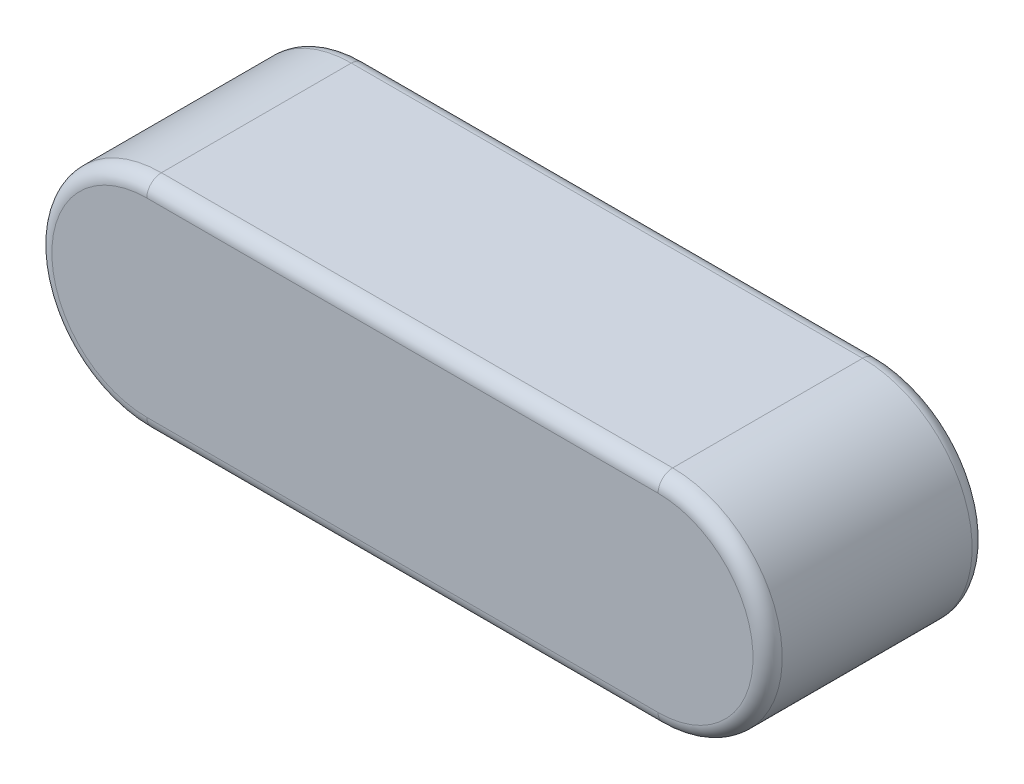
ISO-10303-21;
HEADER;
FILE_DESCRIPTION(('STEP AP214'),'2;1');
FILE_NAME('part.step','',(''),(''),'','','');
FILE_SCHEMA(('AUTOMOTIVE_DESIGN { 1 0 10303 214 1 1 1 1 }'));
ENDSEC;
DATA;
#1=APPLICATION_CONTEXT('core data for automotive mechanical design processes');
#2=APPLICATION_PROTOCOL_DEFINITION('international standard','automotive_design',2000,#1);
#3=PRODUCT_CONTEXT('',#1,'mechanical');
#4=PRODUCT('Part','Part','',(#3));
#5=PRODUCT_RELATED_PRODUCT_CATEGORY('part','',(#4));
#6=PRODUCT_DEFINITION_FORMATION('','',#4);
#7=PRODUCT_DEFINITION_CONTEXT('part definition',#1,'design');
#8=PRODUCT_DEFINITION('design','',#6,#7);
#9=PRODUCT_DEFINITION_SHAPE('','',#8);
#10=(LENGTH_UNIT() NAMED_UNIT(*) SI_UNIT(.MILLI.,.METRE.));
#11=(NAMED_UNIT(*) PLANE_ANGLE_UNIT() SI_UNIT($,.RADIAN.));
#12=(NAMED_UNIT(*) SI_UNIT($,.STERADIAN.) SOLID_ANGLE_UNIT());
#13=UNCERTAINTY_MEASURE_WITH_UNIT(LENGTH_MEASURE(1.E-05),#10,'distance_accuracy_value','');
#14=(GEOMETRIC_REPRESENTATION_CONTEXT(3) GLOBAL_UNCERTAINTY_ASSIGNED_CONTEXT((#13)) GLOBAL_UNIT_ASSIGNED_CONTEXT((#10,
#11,#12)) REPRESENTATION_CONTEXT('',''));
#15=CARTESIAN_POINT('',(0.,0.,0.));
#16=DIRECTION('',(0.,0.,1.));
#17=DIRECTION('',(1.,0.,0.));
#18=AXIS2_PLACEMENT_3D('',#15,#16,#17);
#19=CARTESIAN_POINT('',(-7.,0.,6.));
#20=DIRECTION('',(0.,0.,-1.));
#21=DIRECTION('',(-1.,0.,0.));
#22=AXIS2_PLACEMENT_3D('',#19,#20,#21);
#23=CYLINDRICAL_SURFACE('',#22,3.);
#24=DIRECTION('',(0.,0.,-1.));
#25=VECTOR('',#24,1.);
#26=CARTESIAN_POINT('',(-7.,-3.,6.));
#27=LINE('',#26,#25);
#28=CARTESIAN_POINT('',(-7.,-3.,5.6));
#29=VERTEX_POINT('',#28);
#30=CARTESIAN_POINT('',(-7.,-3.,0.4));
#31=VERTEX_POINT('',#30);
#32=EDGE_CURVE('E134',#29,#31,#27,.T.);
#33=ORIENTED_EDGE('',*,*,#32,.F.);
#34=CARTESIAN_POINT('',(-7.,0.,5.6));
#35=DIRECTION('',(0.,0.,1.));
#36=DIRECTION('',(1.,0.,0.));
#37=AXIS2_PLACEMENT_3D('',#34,#35,#36);
#38=CIRCLE('',#37,3.);
#39=CARTESIAN_POINT('',(-7.,3.,5.6));
#40=VERTEX_POINT('',#39);
#41=EDGE_CURVE('E68',#29,#40,#38,.F.);
#42=ORIENTED_EDGE('',*,*,#41,.T.);
#43=DIRECTION('',(0.,0.,-1.));
#44=VECTOR('',#43,1.);
#45=CARTESIAN_POINT('',(-7.,3.,6.));
#46=LINE('',#45,#44);
#47=CARTESIAN_POINT('',(-7.,3.,0.4));
#48=VERTEX_POINT('',#47);
#49=EDGE_CURVE('E186',#40,#48,#46,.T.);
#50=ORIENTED_EDGE('',*,*,#49,.T.);
#51=CARTESIAN_POINT('',(-7.,0.,0.4));
#52=DIRECTION('',(0.,0.,1.));
#53=DIRECTION('',(1.,0.,0.));
#54=AXIS2_PLACEMENT_3D('',#51,#52,#53);
#55=CIRCLE('',#54,3.);
#56=EDGE_CURVE('E171',#48,#31,#55,.T.);
#57=ORIENTED_EDGE('',*,*,#56,.T.);
#58=EDGE_LOOP('',(#33,#42,#50,#57));
#59=FACE_BOUND('',#58,.T.);
#60=ADVANCED_FACE('F44',(#59),#23,.T.);
#61=CARTESIAN_POINT('',(-7.,-3.,6.));
#62=DIRECTION('',(0.,1.,0.));
#63=DIRECTION('',(-1.,0.,0.));
#64=AXIS2_PLACEMENT_3D('',#61,#62,#63);
#65=PLANE('',#64);
#66=DIRECTION('',(0.,0.,-1.));
#67=VECTOR('',#66,1.);
#68=CARTESIAN_POINT('',(7.,-3.,6.));
#69=LINE('',#68,#67);
#70=CARTESIAN_POINT('',(7.,-3.,5.6));
#71=VERTEX_POINT('',#70);
#72=CARTESIAN_POINT('',(7.,-3.,0.4));
#73=VERTEX_POINT('',#72);
#74=EDGE_CURVE('E223',#71,#73,#69,.T.);
#75=ORIENTED_EDGE('',*,*,#74,.F.);
#76=DIRECTION('',(1.,0.,0.));
#77=VECTOR('',#76,1.);
#78=CARTESIAN_POINT('',(-7.,-3.,5.6));
#79=LINE('',#78,#77);
#80=EDGE_CURVE('E168',#71,#29,#79,.F.);
#81=ORIENTED_EDGE('',*,*,#80,.T.);
#82=ORIENTED_EDGE('',*,*,#32,.T.);
#83=DIRECTION('',(1.,0.,0.));
#84=VECTOR('',#83,1.);
#85=CARTESIAN_POINT('',(-7.,-3.,0.4));
#86=LINE('',#85,#84);
#87=EDGE_CURVE('E165',#31,#73,#86,.T.);
#88=ORIENTED_EDGE('',*,*,#87,.T.);
#89=EDGE_LOOP('',(#75,#81,#82,#88));
#90=FACE_BOUND('',#89,.T.);
#91=ADVANCED_FACE('F242',(#90),#65,.F.);
#92=CARTESIAN_POINT('',(7.,0.,6.));
#93=DIRECTION('',(0.,0.,-1.));
#94=DIRECTION('',(-1.,0.,0.));
#95=AXIS2_PLACEMENT_3D('',#92,#93,#94);
#96=CYLINDRICAL_SURFACE('',#95,3.);
#97=DIRECTION('',(0.,0.,-1.));
#98=VECTOR('',#97,1.);
#99=CARTESIAN_POINT('',(7.,3.,6.));
#100=LINE('',#99,#98);
#101=CARTESIAN_POINT('',(7.,3.,5.6));
#102=VERTEX_POINT('',#101);
#103=CARTESIAN_POINT('',(7.,3.,0.4));
#104=VERTEX_POINT('',#103);
#105=EDGE_CURVE('E221',#102,#104,#100,.T.);
#106=ORIENTED_EDGE('',*,*,#105,.F.);
#107=CARTESIAN_POINT('',(7.,0.,5.6));
#108=DIRECTION('',(0.,0.,1.));
#109=DIRECTION('',(1.,0.,0.));
#110=AXIS2_PLACEMENT_3D('',#107,#108,#109);
#111=CIRCLE('',#110,3.);
#112=EDGE_CURVE('E119',#102,#71,#111,.F.);
#113=ORIENTED_EDGE('',*,*,#112,.T.);
#114=ORIENTED_EDGE('',*,*,#74,.T.);
#115=CARTESIAN_POINT('',(7.,0.,0.4));
#116=DIRECTION('',(0.,0.,1.));
#117=DIRECTION('',(1.,0.,0.));
#118=AXIS2_PLACEMENT_3D('',#115,#116,#117);
#119=CIRCLE('',#118,3.);
#120=EDGE_CURVE('E141',#73,#104,#119,.T.);
#121=ORIENTED_EDGE('',*,*,#120,.T.);
#122=EDGE_LOOP('',(#106,#113,#114,#121));
#123=FACE_BOUND('',#122,.T.);
#124=ADVANCED_FACE('F220',(#123),#96,.T.);
#125=CARTESIAN_POINT('',(-7.,3.,6.));
#126=DIRECTION('',(0.,-1.,0.));
#127=DIRECTION('',(1.,0.,0.));
#128=AXIS2_PLACEMENT_3D('',#125,#126,#127);
#129=PLANE('',#128);
#130=ORIENTED_EDGE('',*,*,#49,.F.);
#131=DIRECTION('',(-1.,0.,0.));
#132=VECTOR('',#131,1.);
#133=CARTESIAN_POINT('',(7.,3.,5.6));
#134=LINE('',#133,#132);
#135=EDGE_CURVE('E11',#40,#102,#134,.F.);
#136=ORIENTED_EDGE('',*,*,#135,.T.);
#137=ORIENTED_EDGE('',*,*,#105,.T.);
#138=DIRECTION('',(-1.,0.,0.));
#139=VECTOR('',#138,1.);
#140=CARTESIAN_POINT('',(-7.,3.,0.4));
#141=LINE('',#140,#139);
#142=EDGE_CURVE('E54',#104,#48,#141,.T.);
#143=ORIENTED_EDGE('',*,*,#142,.T.);
#144=EDGE_LOOP('',(#130,#136,#137,#143));
#145=FACE_BOUND('',#144,.T.);
#146=ADVANCED_FACE('F224',(#145),#129,.F.);
#147=CARTESIAN_POINT('',(-7.,0.,6.));
#148=DIRECTION('',(0.,0.,1.));
#149=DIRECTION('',(1.,0.,0.));
#150=AXIS2_PLACEMENT_3D('',#147,#148,#149);
#151=PLANE('',#150);
#152=DIRECTION('',(1.,0.,0.));
#153=VECTOR('',#152,1.);
#154=CARTESIAN_POINT('',(7.,-2.6,6.));
#155=LINE('',#154,#153);
#156=CARTESIAN_POINT('',(-7.,-2.6,6.));
#157=VERTEX_POINT('',#156);
#158=CARTESIAN_POINT('',(7.,-2.6,6.));
#159=VERTEX_POINT('',#158);
#160=EDGE_CURVE('E138',#157,#159,#155,.T.);
#161=ORIENTED_EDGE('',*,*,#160,.T.);
#162=CARTESIAN_POINT('',(7.,0.,6.));
#163=DIRECTION('',(0.,0.,1.));
#164=DIRECTION('',(1.,0.,0.));
#165=AXIS2_PLACEMENT_3D('',#162,#163,#164);
#166=CIRCLE('',#165,2.6);
#167=CARTESIAN_POINT('',(7.,2.6,6.));
#168=VERTEX_POINT('',#167);
#169=EDGE_CURVE('E117',#159,#168,#166,.T.);
#170=ORIENTED_EDGE('',*,*,#169,.T.);
#171=DIRECTION('',(-1.,0.,0.));
#172=VECTOR('',#171,1.);
#173=CARTESIAN_POINT('',(-7.,2.6,6.));
#174=LINE('',#173,#172);
#175=CARTESIAN_POINT('',(-7.,2.6,6.));
#176=VERTEX_POINT('',#175);
#177=EDGE_CURVE('E126',#168,#176,#174,.T.);
#178=ORIENTED_EDGE('',*,*,#177,.T.);
#179=CARTESIAN_POINT('',(-7.,0.,6.));
#180=DIRECTION('',(0.,0.,1.));
#181=DIRECTION('',(1.,0.,0.));
#182=AXIS2_PLACEMENT_3D('',#179,#180,#181);
#183=CIRCLE('',#182,2.6);
#184=EDGE_CURVE('E133',#176,#157,#183,.T.);
#185=ORIENTED_EDGE('',*,*,#184,.T.);
#186=EDGE_LOOP('',(#161,#170,#178,#185));
#187=FACE_BOUND('',#186,.T.);
#188=ADVANCED_FACE('F136',(#187),#151,.T.);
#189=CARTESIAN_POINT('',(-7.,0.,0.));
#190=DIRECTION('',(0.,0.,1.));
#191=DIRECTION('',(1.,0.,0.));
#192=AXIS2_PLACEMENT_3D('',#189,#190,#191);
#193=PLANE('',#192);
#194=DIRECTION('',(-1.,0.,0.));
#195=VECTOR('',#194,1.);
#196=CARTESIAN_POINT('',(-7.,2.6,0.));
#197=LINE('',#196,#195);
#198=CARTESIAN_POINT('',(-7.,2.6,0.));
#199=VERTEX_POINT('',#198);
#200=CARTESIAN_POINT('',(7.,2.6,0.));
#201=VERTEX_POINT('',#200);
#202=EDGE_CURVE('E158',#199,#201,#197,.F.);
#203=ORIENTED_EDGE('',*,*,#202,.T.);
#204=CARTESIAN_POINT('',(7.,0.,0.));
#205=DIRECTION('',(0.,0.,1.));
#206=DIRECTION('',(1.,0.,0.));
#207=AXIS2_PLACEMENT_3D('',#204,#205,#206);
#208=CIRCLE('',#207,2.6);
#209=CARTESIAN_POINT('',(7.,-2.6,0.));
#210=VERTEX_POINT('',#209);
#211=EDGE_CURVE('E161',#201,#210,#208,.F.);
#212=ORIENTED_EDGE('',*,*,#211,.T.);
#213=DIRECTION('',(1.,0.,0.));
#214=VECTOR('',#213,1.);
#215=CARTESIAN_POINT('',(-7.,-2.6,0.));
#216=LINE('',#215,#214);
#217=CARTESIAN_POINT('',(-7.,-2.6,0.));
#218=VERTEX_POINT('',#217);
#219=EDGE_CURVE('E152',#210,#218,#216,.F.);
#220=ORIENTED_EDGE('',*,*,#219,.T.);
#221=CARTESIAN_POINT('',(-7.,0.,0.));
#222=DIRECTION('',(0.,0.,1.));
#223=DIRECTION('',(1.,0.,0.));
#224=AXIS2_PLACEMENT_3D('',#221,#222,#223);
#225=CIRCLE('',#224,2.6);
#226=EDGE_CURVE('E155',#218,#199,#225,.F.);
#227=ORIENTED_EDGE('',*,*,#226,.T.);
#228=EDGE_LOOP('',(#203,#212,#220,#227));
#229=FACE_BOUND('',#228,.T.);
#230=ADVANCED_FACE('F210',(#229),#193,.F.);
#231=CARTESIAN_POINT('',(-7.,0.,5.6));
#232=DIRECTION('',(0.,0.,1.));
#233=DIRECTION('',(1.,0.,0.));
#234=AXIS2_PLACEMENT_3D('',#231,#232,#233);
#235=TOROIDAL_SURFACE('',#234,2.6,0.4);
#236=CARTESIAN_POINT('',(-7.,2.6,5.6));
#237=DIRECTION('',(1.,0.,0.));
#238=DIRECTION('',(0.,0.,-1.));
#239=AXIS2_PLACEMENT_3D('',#236,#237,#238);
#240=CIRCLE('',#239,0.4);
#241=EDGE_CURVE('E129',#40,#176,#240,.T.);
#242=ORIENTED_EDGE('',*,*,#241,.F.);
#243=ORIENTED_EDGE('',*,*,#41,.F.);
#244=CARTESIAN_POINT('',(-7.,-2.6,5.6));
#245=DIRECTION('',(1.,0.,0.));
#246=DIRECTION('',(0.,0.,-1.));
#247=AXIS2_PLACEMENT_3D('',#244,#245,#246);
#248=CIRCLE('',#247,0.4);
#249=EDGE_CURVE('E182',#157,#29,#248,.T.);
#250=ORIENTED_EDGE('',*,*,#249,.F.);
#251=ORIENTED_EDGE('',*,*,#184,.F.);
#252=EDGE_LOOP('',(#242,#243,#250,#251));
#253=FACE_BOUND('',#252,.T.);
#254=ADVANCED_FACE('F237',(#253),#235,.T.);
#255=CARTESIAN_POINT('',(-7.,-2.6,5.6));
#256=DIRECTION('',(-1.,0.,0.));
#257=DIRECTION('',(0.,-1.,0.));
#258=AXIS2_PLACEMENT_3D('',#255,#256,#257);
#259=CYLINDRICAL_SURFACE('',#258,0.4);
#260=ORIENTED_EDGE('',*,*,#249,.T.);
#261=ORIENTED_EDGE('',*,*,#80,.F.);
#262=CARTESIAN_POINT('',(7.,-2.6,5.6));
#263=DIRECTION('',(1.,0.,0.));
#264=DIRECTION('',(0.,0.,-1.));
#265=AXIS2_PLACEMENT_3D('',#262,#263,#264);
#266=CIRCLE('',#265,0.4);
#267=EDGE_CURVE('E123',#159,#71,#266,.T.);
#268=ORIENTED_EDGE('',*,*,#267,.F.);
#269=ORIENTED_EDGE('',*,*,#160,.F.);
#270=EDGE_LOOP('',(#260,#261,#268,#269));
#271=FACE_BOUND('',#270,.T.);
#272=ADVANCED_FACE('F240',(#271),#259,.T.);
#273=CARTESIAN_POINT('',(-7.,2.6,5.6));
#274=DIRECTION('',(1.,0.,0.));
#275=DIRECTION('',(0.,1.,0.));
#276=AXIS2_PLACEMENT_3D('',#273,#274,#275);
#277=CYLINDRICAL_SURFACE('',#276,0.4);
#278=ORIENTED_EDGE('',*,*,#241,.T.);
#279=ORIENTED_EDGE('',*,*,#177,.F.);
#280=CARTESIAN_POINT('',(7.,2.6,5.6));
#281=DIRECTION('',(1.,0.,0.));
#282=DIRECTION('',(0.,0.,-1.));
#283=AXIS2_PLACEMENT_3D('',#280,#281,#282);
#284=CIRCLE('',#283,0.4);
#285=EDGE_CURVE('E113',#102,#168,#284,.T.);
#286=ORIENTED_EDGE('',*,*,#285,.F.);
#287=ORIENTED_EDGE('',*,*,#135,.F.);
#288=EDGE_LOOP('',(#278,#279,#286,#287));
#289=FACE_BOUND('',#288,.T.);
#290=ADVANCED_FACE('F127',(#289),#277,.T.);
#291=CARTESIAN_POINT('',(7.,0.,5.6));
#292=DIRECTION('',(0.,0.,1.));
#293=DIRECTION('',(1.,0.,0.));
#294=AXIS2_PLACEMENT_3D('',#291,#292,#293);
#295=TOROIDAL_SURFACE('',#294,2.6,0.4);
#296=ORIENTED_EDGE('',*,*,#267,.T.);
#297=ORIENTED_EDGE('',*,*,#112,.F.);
#298=ORIENTED_EDGE('',*,*,#285,.T.);
#299=ORIENTED_EDGE('',*,*,#169,.F.);
#300=EDGE_LOOP('',(#296,#297,#298,#299));
#301=FACE_BOUND('',#300,.T.);
#302=ADVANCED_FACE('F115',(#301),#295,.T.);
#303=CARTESIAN_POINT('',(-7.,0.,0.4));
#304=DIRECTION('',(0.,0.,1.));
#305=DIRECTION('',(1.,0.,0.));
#306=AXIS2_PLACEMENT_3D('',#303,#304,#305);
#307=TOROIDAL_SURFACE('',#306,2.6,0.4);
#308=CARTESIAN_POINT('',(-7.,2.6,0.4));
#309=DIRECTION('',(1.,0.,0.));
#310=DIRECTION('',(0.,0.,-1.));
#311=AXIS2_PLACEMENT_3D('',#308,#309,#310);
#312=CIRCLE('',#311,0.4);
#313=EDGE_CURVE('E192',#199,#48,#312,.T.);
#314=ORIENTED_EDGE('',*,*,#313,.F.);
#315=ORIENTED_EDGE('',*,*,#226,.F.);
#316=CARTESIAN_POINT('',(-7.,-2.6,0.4));
#317=DIRECTION('',(1.,0.,0.));
#318=DIRECTION('',(0.,0.,-1.));
#319=AXIS2_PLACEMENT_3D('',#316,#317,#318);
#320=CIRCLE('',#319,0.4);
#321=EDGE_CURVE('E48',#31,#218,#320,.T.);
#322=ORIENTED_EDGE('',*,*,#321,.F.);
#323=ORIENTED_EDGE('',*,*,#56,.F.);
#324=EDGE_LOOP('',(#314,#315,#322,#323));
#325=FACE_BOUND('',#324,.T.);
#326=ADVANCED_FACE('F46',(#325),#307,.T.);
#327=CARTESIAN_POINT('',(-7.,-2.6,0.4));
#328=DIRECTION('',(1.,0.,0.));
#329=DIRECTION('',(0.,1.,0.));
#330=AXIS2_PLACEMENT_3D('',#327,#328,#329);
#331=CYLINDRICAL_SURFACE('',#330,0.4);
#332=ORIENTED_EDGE('',*,*,#321,.T.);
#333=ORIENTED_EDGE('',*,*,#219,.F.);
#334=CARTESIAN_POINT('',(7.,-2.6,0.4));
#335=DIRECTION('',(1.,0.,0.));
#336=DIRECTION('',(0.,0.,-1.));
#337=AXIS2_PLACEMENT_3D('',#334,#335,#336);
#338=CIRCLE('',#337,0.4);
#339=EDGE_CURVE('E190',#73,#210,#338,.T.);
#340=ORIENTED_EDGE('',*,*,#339,.F.);
#341=ORIENTED_EDGE('',*,*,#87,.F.);
#342=EDGE_LOOP('',(#332,#333,#340,#341));
#343=FACE_BOUND('',#342,.T.);
#344=ADVANCED_FACE('F204',(#343),#331,.T.);
#345=CARTESIAN_POINT('',(-7.,2.6,0.4));
#346=DIRECTION('',(-1.,0.,0.));
#347=DIRECTION('',(0.,-1.,0.));
#348=AXIS2_PLACEMENT_3D('',#345,#346,#347);
#349=CYLINDRICAL_SURFACE('',#348,0.4);
#350=ORIENTED_EDGE('',*,*,#313,.T.);
#351=ORIENTED_EDGE('',*,*,#142,.F.);
#352=CARTESIAN_POINT('',(7.,2.6,0.4));
#353=DIRECTION('',(1.,0.,0.));
#354=DIRECTION('',(0.,0.,-1.));
#355=AXIS2_PLACEMENT_3D('',#352,#353,#354);
#356=CIRCLE('',#355,0.4);
#357=EDGE_CURVE('E187',#201,#104,#356,.T.);
#358=ORIENTED_EDGE('',*,*,#357,.F.);
#359=ORIENTED_EDGE('',*,*,#202,.F.);
#360=EDGE_LOOP('',(#350,#351,#358,#359));
#361=FACE_BOUND('',#360,.T.);
#362=ADVANCED_FACE('F216',(#361),#349,.T.);
#363=CARTESIAN_POINT('',(7.,0.,0.4));
#364=DIRECTION('',(0.,0.,1.));
#365=DIRECTION('',(1.,0.,0.));
#366=AXIS2_PLACEMENT_3D('',#363,#364,#365);
#367=TOROIDAL_SURFACE('',#366,2.6,0.4);
#368=ORIENTED_EDGE('',*,*,#339,.T.);
#369=ORIENTED_EDGE('',*,*,#211,.F.);
#370=ORIENTED_EDGE('',*,*,#357,.T.);
#371=ORIENTED_EDGE('',*,*,#120,.F.);
#372=EDGE_LOOP('',(#368,#369,#370,#371));
#373=FACE_BOUND('',#372,.T.);
#374=ADVANCED_FACE('F214',(#373),#367,.T.);
#375=CLOSED_SHELL('',(#60,#91,#124,#146,#188,#230,#254,#272,#290,#302,#326,#344,#362,#374));
#376=MANIFOLD_SOLID_BREP('B2',#375);
#377=ADVANCED_BREP_SHAPE_REPRESENTATION('',(#18,#376),#14);
#378=SHAPE_DEFINITION_REPRESENTATION(#9,#377);
ENDSEC;
END-ISO-10303-21;
